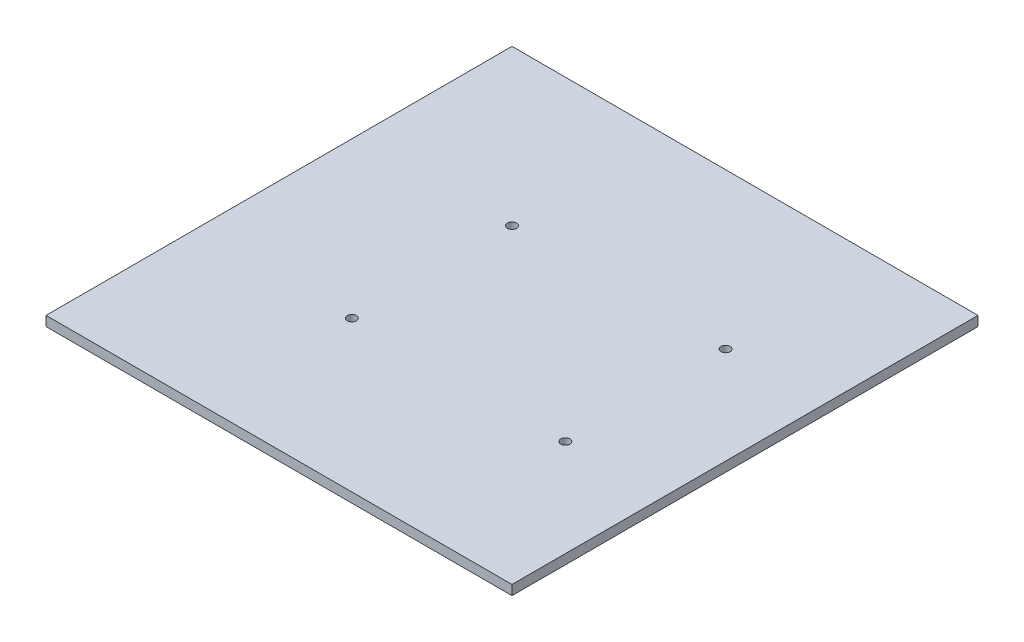
ISO-10303-21;
HEADER;
FILE_DESCRIPTION(('STEP AP214'),'2;1');
FILE_NAME('part.step','',(''),(''),'','','');
FILE_SCHEMA(('AUTOMOTIVE_DESIGN { 1 0 10303 214 1 1 1 1 }'));
ENDSEC;
DATA;
#1=APPLICATION_CONTEXT('core data for automotive mechanical design processes');
#2=APPLICATION_PROTOCOL_DEFINITION('international standard','automotive_design',2000,#1);
#3=PRODUCT_CONTEXT('',#1,'mechanical');
#4=PRODUCT('Part','Part','',(#3));
#5=PRODUCT_RELATED_PRODUCT_CATEGORY('part','',(#4));
#6=PRODUCT_DEFINITION_FORMATION('','',#4);
#7=PRODUCT_DEFINITION_CONTEXT('part definition',#1,'design');
#8=PRODUCT_DEFINITION('design','',#6,#7);
#9=PRODUCT_DEFINITION_SHAPE('','',#8);
#10=(LENGTH_UNIT() NAMED_UNIT(*) SI_UNIT(.MILLI.,.METRE.));
#11=(NAMED_UNIT(*) PLANE_ANGLE_UNIT() SI_UNIT($,.RADIAN.));
#12=(NAMED_UNIT(*) SI_UNIT($,.STERADIAN.) SOLID_ANGLE_UNIT());
#13=UNCERTAINTY_MEASURE_WITH_UNIT(LENGTH_MEASURE(1.E-05),#10,'distance_accuracy_value','');
#14=(GEOMETRIC_REPRESENTATION_CONTEXT(3) GLOBAL_UNCERTAINTY_ASSIGNED_CONTEXT((#13)) GLOBAL_UNIT_ASSIGNED_CONTEXT((#10,
#11,#12)) REPRESENTATION_CONTEXT('',''));
#15=CARTESIAN_POINT('',(0.,0.,0.));
#16=DIRECTION('',(0.,0.,1.));
#17=DIRECTION('',(1.,0.,0.));
#18=AXIS2_PLACEMENT_3D('',#15,#16,#17);
#19=CARTESIAN_POINT('',(76.2,3.175,76.2));
#20=DIRECTION('',(-1.,0.,0.));
#21=DIRECTION('',(0.,0.,1.));
#22=AXIS2_PLACEMENT_3D('',#19,#20,#21);
#23=PLANE('',#22);
#24=DIRECTION('',(0.,0.,-1.));
#25=VECTOR('',#24,1.);
#26=CARTESIAN_POINT('',(76.2,0.,76.2));
#27=LINE('',#26,#25);
#28=CARTESIAN_POINT('',(76.2,0.,76.2));
#29=VERTEX_POINT('',#28);
#30=CARTESIAN_POINT('',(76.2,0.,-76.2));
#31=VERTEX_POINT('',#30);
#32=EDGE_CURVE('E96',#29,#31,#27,.T.);
#33=ORIENTED_EDGE('',*,*,#32,.T.);
#34=DIRECTION('',(0.,-1.,0.));
#35=VECTOR('',#34,1.);
#36=CARTESIAN_POINT('',(76.2,3.175,-76.2));
#37=LINE('',#36,#35);
#38=CARTESIAN_POINT('',(76.2,3.175,-76.2));
#39=VERTEX_POINT('',#38);
#40=EDGE_CURVE('E11',#39,#31,#37,.T.);
#41=ORIENTED_EDGE('',*,*,#40,.F.);
#42=DIRECTION('',(0.,0.,-1.));
#43=VECTOR('',#42,1.);
#44=CARTESIAN_POINT('',(76.2,3.175,76.2));
#45=LINE('',#44,#43);
#46=CARTESIAN_POINT('',(76.2,3.175,76.2));
#47=VERTEX_POINT('',#46);
#48=EDGE_CURVE('E84',#47,#39,#45,.T.);
#49=ORIENTED_EDGE('',*,*,#48,.F.);
#50=DIRECTION('',(0.,-1.,0.));
#51=VECTOR('',#50,1.);
#52=CARTESIAN_POINT('',(76.2,3.175,76.2));
#53=LINE('',#52,#51);
#54=EDGE_CURVE('E92',#47,#29,#53,.T.);
#55=ORIENTED_EDGE('',*,*,#54,.T.);
#56=EDGE_LOOP('',(#33,#41,#49,#55));
#57=FACE_BOUND('',#56,.T.);
#58=ADVANCED_FACE('F33',(#57),#23,.F.);
#59=CARTESIAN_POINT('',(-76.2,3.175,-76.2));
#60=DIRECTION('',(0.,0.,1.));
#61=DIRECTION('',(1.,0.,0.));
#62=AXIS2_PLACEMENT_3D('',#59,#60,#61);
#63=PLANE('',#62);
#64=DIRECTION('',(-1.,0.,0.));
#65=VECTOR('',#64,1.);
#66=CARTESIAN_POINT('',(-76.2,0.,-76.2));
#67=LINE('',#66,#65);
#68=CARTESIAN_POINT('',(-76.2,0.,-76.2));
#69=VERTEX_POINT('',#68);
#70=EDGE_CURVE('E88',#31,#69,#67,.T.);
#71=ORIENTED_EDGE('',*,*,#70,.T.);
#72=DIRECTION('',(0.,-1.,0.));
#73=VECTOR('',#72,1.);
#74=CARTESIAN_POINT('',(-76.2,3.175,-76.2));
#75=LINE('',#74,#73);
#76=CARTESIAN_POINT('',(-76.2,3.175,-76.2));
#77=VERTEX_POINT('',#76);
#78=EDGE_CURVE('E41',#77,#69,#75,.T.);
#79=ORIENTED_EDGE('',*,*,#78,.F.);
#80=DIRECTION('',(-1.,0.,0.));
#81=VECTOR('',#80,1.);
#82=CARTESIAN_POINT('',(-76.2,3.175,-76.2));
#83=LINE('',#82,#81);
#84=EDGE_CURVE('E79',#39,#77,#83,.T.);
#85=ORIENTED_EDGE('',*,*,#84,.F.);
#86=ORIENTED_EDGE('',*,*,#40,.T.);
#87=EDGE_LOOP('',(#71,#79,#85,#86));
#88=FACE_BOUND('',#87,.T.);
#89=ADVANCED_FACE('F87',(#88),#63,.F.);
#90=CARTESIAN_POINT('',(-76.2,3.175,76.2));
#91=DIRECTION('',(1.,0.,0.));
#92=DIRECTION('',(0.,0.,-1.));
#93=AXIS2_PLACEMENT_3D('',#90,#91,#92);
#94=PLANE('',#93);
#95=DIRECTION('',(0.,0.,1.));
#96=VECTOR('',#95,1.);
#97=CARTESIAN_POINT('',(-76.2,0.,76.2));
#98=LINE('',#97,#96);
#99=CARTESIAN_POINT('',(-76.2,0.,76.2));
#100=VERTEX_POINT('',#99);
#101=EDGE_CURVE('E66',#69,#100,#98,.T.);
#102=ORIENTED_EDGE('',*,*,#101,.T.);
#103=DIRECTION('',(0.,-1.,0.));
#104=VECTOR('',#103,1.);
#105=CARTESIAN_POINT('',(-76.2,3.175,76.2));
#106=LINE('',#105,#104);
#107=CARTESIAN_POINT('',(-76.2,3.175,76.2));
#108=VERTEX_POINT('',#107);
#109=EDGE_CURVE('E89',#108,#100,#106,.T.);
#110=ORIENTED_EDGE('',*,*,#109,.F.);
#111=DIRECTION('',(0.,0.,1.));
#112=VECTOR('',#111,1.);
#113=CARTESIAN_POINT('',(-76.2,3.175,76.2));
#114=LINE('',#113,#112);
#115=EDGE_CURVE('E82',#77,#108,#114,.T.);
#116=ORIENTED_EDGE('',*,*,#115,.F.);
#117=ORIENTED_EDGE('',*,*,#78,.T.);
#118=EDGE_LOOP('',(#102,#110,#116,#117));
#119=FACE_BOUND('',#118,.T.);
#120=ADVANCED_FACE('F90',(#119),#94,.F.);
#121=CARTESIAN_POINT('',(-76.2,3.175,76.2));
#122=DIRECTION('',(0.,0.,-1.));
#123=DIRECTION('',(-1.,0.,0.));
#124=AXIS2_PLACEMENT_3D('',#121,#122,#123);
#125=PLANE('',#124);
#126=DIRECTION('',(1.,0.,0.));
#127=VECTOR('',#126,1.);
#128=CARTESIAN_POINT('',(-76.2,0.,76.2));
#129=LINE('',#128,#127);
#130=EDGE_CURVE('E72',#100,#29,#129,.T.);
#131=ORIENTED_EDGE('',*,*,#130,.T.);
#132=ORIENTED_EDGE('',*,*,#54,.F.);
#133=DIRECTION('',(1.,0.,0.));
#134=VECTOR('',#133,1.);
#135=CARTESIAN_POINT('',(-76.2,3.175,76.2));
#136=LINE('',#135,#134);
#137=EDGE_CURVE('E49',#108,#47,#136,.T.);
#138=ORIENTED_EDGE('',*,*,#137,.F.);
#139=ORIENTED_EDGE('',*,*,#109,.T.);
#140=EDGE_LOOP('',(#131,#132,#138,#139));
#141=FACE_BOUND('',#140,.T.);
#142=ADVANCED_FACE('F104',(#141),#125,.F.);
#143=CARTESIAN_POINT('',(0.,3.175,0.));
#144=DIRECTION('',(0.,-1.,0.));
#145=DIRECTION('',(0.,0.,-1.));
#146=AXIS2_PLACEMENT_3D('',#143,#144,#145);
#147=PLANE('',#146);
#148=CARTESIAN_POINT('',(-25.4,3.175,26.9875));
#149=DIRECTION('',(0.,1.,0.));
#150=DIRECTION('',(0.,0.,1.));
#151=AXIS2_PLACEMENT_3D('',#148,#149,#150);
#152=CIRCLE('',#151,1.49999999999999);
#153=CARTESIAN_POINT('',(-25.4,3.175,28.4875));
#154=VERTEX_POINT('',#153);
#155=EDGE_CURVE('E128',#154,#154,#152,.T.);
#156=ORIENTED_EDGE('',*,*,#155,.F.);
#157=EDGE_LOOP('',(#156));
#158=FACE_BOUND('',#157,.T.);
#159=CARTESIAN_POINT('',(44.45,3.175,-25.4));
#160=DIRECTION('',(0.,1.,0.));
#161=DIRECTION('',(0.,0.,1.));
#162=AXIS2_PLACEMENT_3D('',#159,#160,#161);
#163=CIRCLE('',#162,1.5);
#164=CARTESIAN_POINT('',(44.45,3.175,-23.9));
#165=VERTEX_POINT('',#164);
#166=EDGE_CURVE('E122',#165,#165,#163,.T.);
#167=ORIENTED_EDGE('',*,*,#166,.F.);
#168=EDGE_LOOP('',(#167));
#169=FACE_BOUND('',#168,.T.);
#170=CARTESIAN_POINT('',(44.45,3.175,26.9875));
#171=DIRECTION('',(0.,1.,0.));
#172=DIRECTION('',(0.,0.,1.));
#173=AXIS2_PLACEMENT_3D('',#170,#171,#172);
#174=CIRCLE('',#173,1.5);
#175=CARTESIAN_POINT('',(44.45,3.175,28.4875));
#176=VERTEX_POINT('',#175);
#177=EDGE_CURVE('E116',#176,#176,#174,.T.);
#178=ORIENTED_EDGE('',*,*,#177,.F.);
#179=EDGE_LOOP('',(#178));
#180=FACE_BOUND('',#179,.T.);
#181=CARTESIAN_POINT('',(-25.4,3.175,-25.4));
#182=DIRECTION('',(0.,1.,0.));
#183=DIRECTION('',(0.,0.,1.));
#184=AXIS2_PLACEMENT_3D('',#181,#182,#183);
#185=CIRCLE('',#184,1.49999999999999);
#186=CARTESIAN_POINT('',(-25.4,3.175,-23.9));
#187=VERTEX_POINT('',#186);
#188=EDGE_CURVE('E110',#187,#187,#185,.T.);
#189=ORIENTED_EDGE('',*,*,#188,.F.);
#190=EDGE_LOOP('',(#189));
#191=FACE_BOUND('',#190,.T.);
#192=ORIENTED_EDGE('',*,*,#48,.T.);
#193=ORIENTED_EDGE('',*,*,#84,.T.);
#194=ORIENTED_EDGE('',*,*,#115,.T.);
#195=ORIENTED_EDGE('',*,*,#137,.T.);
#196=EDGE_LOOP('',(#192,#193,#194,#195));
#197=FACE_BOUND('',#196,.T.);
#198=ADVANCED_FACE('F80',(#158,#169,#180,#191,#197),#147,.F.);
#199=CARTESIAN_POINT('',(0.,0.,0.));
#200=DIRECTION('',(0.,-1.,0.));
#201=DIRECTION('',(0.,0.,-1.));
#202=AXIS2_PLACEMENT_3D('',#199,#200,#201);
#203=PLANE('',#202);
#204=CARTESIAN_POINT('',(-25.4,0.,26.9875));
#205=DIRECTION('',(0.,1.,0.));
#206=DIRECTION('',(0.,0.,1.));
#207=AXIS2_PLACEMENT_3D('',#204,#205,#206);
#208=CIRCLE('',#207,1.49999999999999);
#209=CARTESIAN_POINT('',(-25.4,0.,28.4875));
#210=VERTEX_POINT('',#209);
#211=EDGE_CURVE('E113',#210,#210,#208,.T.);
#212=ORIENTED_EDGE('',*,*,#211,.T.);
#213=EDGE_LOOP('',(#212));
#214=FACE_BOUND('',#213,.T.);
#215=CARTESIAN_POINT('',(44.45,0.,-25.4));
#216=DIRECTION('',(0.,1.,0.));
#217=DIRECTION('',(0.,0.,1.));
#218=AXIS2_PLACEMENT_3D('',#215,#216,#217);
#219=CIRCLE('',#218,1.5);
#220=CARTESIAN_POINT('',(44.45,0.,-23.9));
#221=VERTEX_POINT('',#220);
#222=EDGE_CURVE('E125',#221,#221,#219,.T.);
#223=ORIENTED_EDGE('',*,*,#222,.T.);
#224=EDGE_LOOP('',(#223));
#225=FACE_BOUND('',#224,.T.);
#226=CARTESIAN_POINT('',(44.45,0.,26.9875));
#227=DIRECTION('',(0.,1.,0.));
#228=DIRECTION('',(0.,0.,1.));
#229=AXIS2_PLACEMENT_3D('',#226,#227,#228);
#230=CIRCLE('',#229,1.5);
#231=CARTESIAN_POINT('',(44.45,0.,28.4875));
#232=VERTEX_POINT('',#231);
#233=EDGE_CURVE('E119',#232,#232,#230,.T.);
#234=ORIENTED_EDGE('',*,*,#233,.T.);
#235=EDGE_LOOP('',(#234));
#236=FACE_BOUND('',#235,.T.);
#237=CARTESIAN_POINT('',(-25.4,0.,-25.4));
#238=DIRECTION('',(0.,1.,0.));
#239=DIRECTION('',(0.,0.,1.));
#240=AXIS2_PLACEMENT_3D('',#237,#238,#239);
#241=CIRCLE('',#240,1.49999999999999);
#242=CARTESIAN_POINT('',(-25.4,0.,-23.9));
#243=VERTEX_POINT('',#242);
#244=EDGE_CURVE('E99',#243,#243,#241,.T.);
#245=ORIENTED_EDGE('',*,*,#244,.T.);
#246=EDGE_LOOP('',(#245));
#247=FACE_BOUND('',#246,.T.);
#248=ORIENTED_EDGE('',*,*,#32,.F.);
#249=ORIENTED_EDGE('',*,*,#130,.F.);
#250=ORIENTED_EDGE('',*,*,#101,.F.);
#251=ORIENTED_EDGE('',*,*,#70,.F.);
#252=EDGE_LOOP('',(#248,#249,#250,#251));
#253=FACE_BOUND('',#252,.T.);
#254=ADVANCED_FACE('F107',(#214,#225,#236,#247,#253),#203,.T.);
#255=CARTESIAN_POINT('',(-25.4,0.,-25.4));
#256=DIRECTION('',(0.,1.,0.));
#257=DIRECTION('',(0.,0.,1.));
#258=AXIS2_PLACEMENT_3D('',#255,#256,#257);
#259=CYLINDRICAL_SURFACE('',#258,1.49999999999999);
#260=ORIENTED_EDGE('',*,*,#244,.F.);
#261=EDGE_LOOP('',(#260));
#262=FACE_BOUND('',#261,.T.);
#263=ORIENTED_EDGE('',*,*,#188,.T.);
#264=EDGE_LOOP('',(#263));
#265=FACE_BOUND('',#264,.T.);
#266=ADVANCED_FACE('F152',(#262,#265),#259,.F.);
#267=CARTESIAN_POINT('',(44.45,0.,26.9875));
#268=DIRECTION('',(0.,1.,0.));
#269=DIRECTION('',(0.,0.,1.));
#270=AXIS2_PLACEMENT_3D('',#267,#268,#269);
#271=CYLINDRICAL_SURFACE('',#270,1.5);
#272=ORIENTED_EDGE('',*,*,#233,.F.);
#273=EDGE_LOOP('',(#272));
#274=FACE_BOUND('',#273,.T.);
#275=ORIENTED_EDGE('',*,*,#177,.T.);
#276=EDGE_LOOP('',(#275));
#277=FACE_BOUND('',#276,.T.);
#278=ADVANCED_FACE('F154',(#274,#277),#271,.F.);
#279=CARTESIAN_POINT('',(44.45,0.,-25.4));
#280=DIRECTION('',(0.,1.,0.));
#281=DIRECTION('',(0.,0.,1.));
#282=AXIS2_PLACEMENT_3D('',#279,#280,#281);
#283=CYLINDRICAL_SURFACE('',#282,1.5);
#284=ORIENTED_EDGE('',*,*,#222,.F.);
#285=EDGE_LOOP('',(#284));
#286=FACE_BOUND('',#285,.T.);
#287=ORIENTED_EDGE('',*,*,#166,.T.);
#288=EDGE_LOOP('',(#287));
#289=FACE_BOUND('',#288,.T.);
#290=ADVANCED_FACE('F139',(#286,#289),#283,.F.);
#291=CARTESIAN_POINT('',(-25.4,0.,26.9875));
#292=DIRECTION('',(0.,1.,0.));
#293=DIRECTION('',(0.,0.,1.));
#294=AXIS2_PLACEMENT_3D('',#291,#292,#293);
#295=CYLINDRICAL_SURFACE('',#294,1.49999999999999);
#296=ORIENTED_EDGE('',*,*,#211,.F.);
#297=EDGE_LOOP('',(#296));
#298=FACE_BOUND('',#297,.T.);
#299=ORIENTED_EDGE('',*,*,#155,.T.);
#300=EDGE_LOOP('',(#299));
#301=FACE_BOUND('',#300,.T.);
#302=ADVANCED_FACE('F136',(#298,#301),#295,.F.);
#303=CLOSED_SHELL('',(#58,#89,#120,#142,#198,#254,#266,#278,#290,#302));
#304=MANIFOLD_SOLID_BREP('B2',#303);
#305=ADVANCED_BREP_SHAPE_REPRESENTATION('',(#18,#304),#14);
#306=SHAPE_DEFINITION_REPRESENTATION(#9,#305);
ENDSEC;
END-ISO-10303-21;
